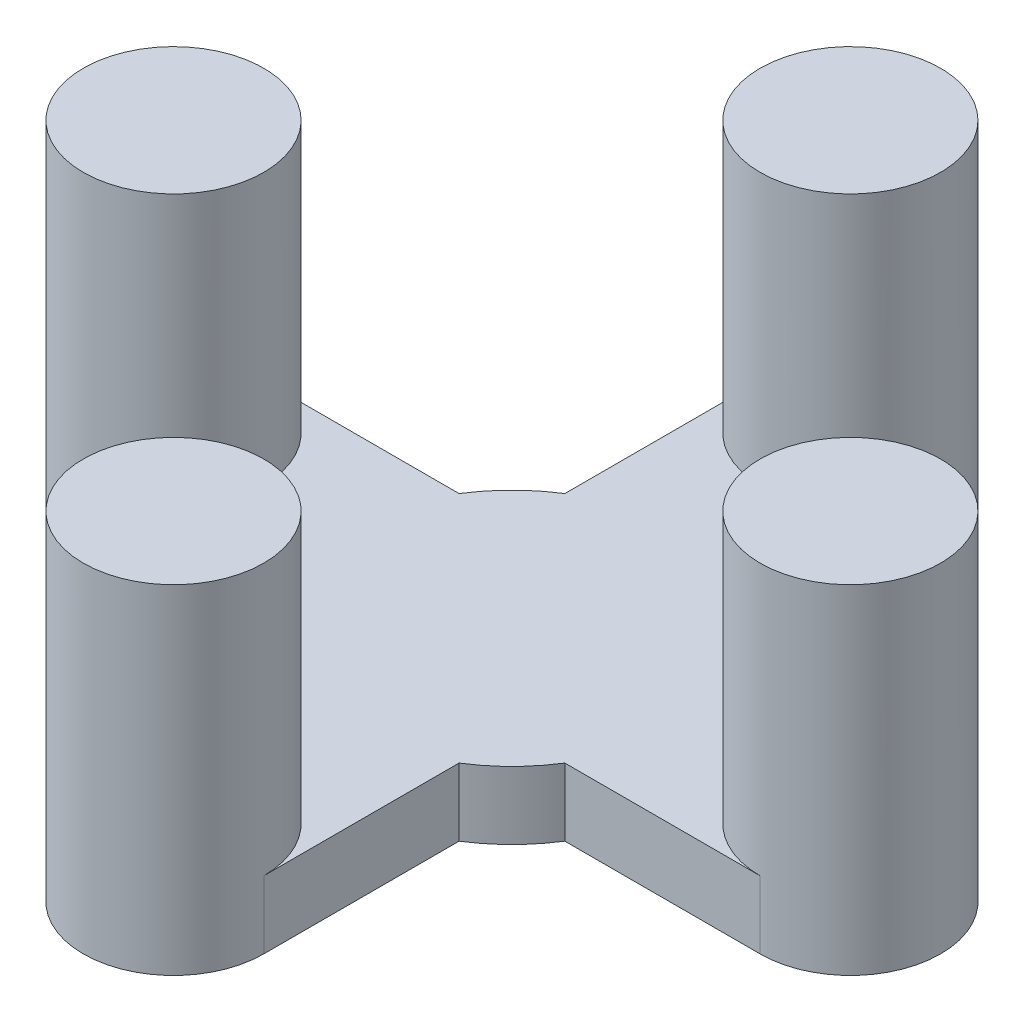
ISO-10303-21;
HEADER;
FILE_DESCRIPTION(('STEP AP214'),'2;1');
FILE_NAME('part.step','',(''),(''),'','','');
FILE_SCHEMA(('AUTOMOTIVE_DESIGN { 1 0 10303 214 1 1 1 1 }'));
ENDSEC;
DATA;
#1=APPLICATION_CONTEXT('core data for automotive mechanical design processes');
#2=APPLICATION_PROTOCOL_DEFINITION('international standard','automotive_design',2000,#1);
#3=PRODUCT_CONTEXT('',#1,'mechanical');
#4=PRODUCT('Part','Part','',(#3));
#5=PRODUCT_RELATED_PRODUCT_CATEGORY('part','',(#4));
#6=PRODUCT_DEFINITION_FORMATION('','',#4);
#7=PRODUCT_DEFINITION_CONTEXT('part definition',#1,'design');
#8=PRODUCT_DEFINITION('design','',#6,#7);
#9=PRODUCT_DEFINITION_SHAPE('','',#8);
#10=(LENGTH_UNIT() NAMED_UNIT(*) SI_UNIT(.MILLI.,.METRE.));
#11=(NAMED_UNIT(*) PLANE_ANGLE_UNIT() SI_UNIT($,.RADIAN.));
#12=(NAMED_UNIT(*) SI_UNIT($,.STERADIAN.) SOLID_ANGLE_UNIT());
#13=UNCERTAINTY_MEASURE_WITH_UNIT(LENGTH_MEASURE(1.E-05),#10,'distance_accuracy_value','');
#14=(GEOMETRIC_REPRESENTATION_CONTEXT(3) GLOBAL_UNCERTAINTY_ASSIGNED_CONTEXT((#13)) GLOBAL_UNIT_ASSIGNED_CONTEXT((#10,
#11,#12)) REPRESENTATION_CONTEXT('',''));
#15=CARTESIAN_POINT('',(0.,0.,0.));
#16=DIRECTION('',(0.,0.,1.));
#17=DIRECTION('',(1.,0.,0.));
#18=AXIS2_PLACEMENT_3D('',#15,#16,#17);
#19=CARTESIAN_POINT('',(0.,3.,0.));
#20=DIRECTION('',(0.,1.,0.));
#21=DIRECTION('',(0.,0.,1.));
#22=AXIS2_PLACEMENT_3D('',#19,#20,#21);
#23=PLANE('',#22);
#24=DIRECTION('',(0.,0.,-1.));
#25=VECTOR('',#24,1.);
#26=CARTESIAN_POINT('',(4.,3.,-15.));
#27=LINE('',#26,#25);
#28=CARTESIAN_POINT('',(4.,3.,-6.34428877022476));
#29=VERTEX_POINT('',#28);
#30=CARTESIAN_POINT('',(4.,3.,-15.));
#31=VERTEX_POINT('',#30);
#32=EDGE_CURVE('E284',#29,#31,#27,.T.);
#33=ORIENTED_EDGE('',*,*,#32,.T.);
#34=CARTESIAN_POINT('',(0.,3.,-15.));
#35=DIRECTION('',(0.,1.,0.));
#36=DIRECTION('',(0.,0.,1.));
#37=AXIS2_PLACEMENT_3D('',#34,#35,#36);
#38=CIRCLE('',#37,3.99999999999999);
#39=CARTESIAN_POINT('',(-4.,3.,-15.));
#40=VERTEX_POINT('',#39);
#41=EDGE_CURVE('E288',#40,#31,#38,.T.);
#42=ORIENTED_EDGE('',*,*,#41,.F.);
#43=DIRECTION('',(0.,0.,1.));
#44=VECTOR('',#43,1.);
#45=CARTESIAN_POINT('',(-4.,3.,-15.));
#46=LINE('',#45,#44);
#47=CARTESIAN_POINT('',(-3.99999999999999,3.,-6.34428877022476));
#48=VERTEX_POINT('',#47);
#49=EDGE_CURVE('E158',#40,#48,#46,.T.);
#50=ORIENTED_EDGE('',*,*,#49,.T.);
#51=CARTESIAN_POINT('',(0.,3.,0.));
#52=DIRECTION('',(0.,1.,0.));
#53=DIRECTION('',(0.,0.,1.));
#54=AXIS2_PLACEMENT_3D('',#51,#52,#53);
#55=CIRCLE('',#54,7.5);
#56=CARTESIAN_POINT('',(-6.34428877022475,3.,-4.00000000000001));
#57=VERTEX_POINT('',#56);
#58=EDGE_CURVE('E151',#48,#57,#55,.T.);
#59=ORIENTED_EDGE('',*,*,#58,.T.);
#60=DIRECTION('',(-1.,0.,0.));
#61=VECTOR('',#60,1.);
#62=CARTESIAN_POINT('',(-15.,3.,-4.00000000000001));
#63=LINE('',#62,#61);
#64=CARTESIAN_POINT('',(-15.,3.,-4.00000000000001));
#65=VERTEX_POINT('',#64);
#66=EDGE_CURVE('E154',#57,#65,#63,.T.);
#67=ORIENTED_EDGE('',*,*,#66,.T.);
#68=CARTESIAN_POINT('',(-15.,3.,0.));
#69=DIRECTION('',(0.,1.,0.));
#70=DIRECTION('',(0.,0.,1.));
#71=AXIS2_PLACEMENT_3D('',#68,#69,#70);
#72=CIRCLE('',#71,4.);
#73=CARTESIAN_POINT('',(-15.,3.,4.));
#74=VERTEX_POINT('',#73);
#75=EDGE_CURVE('E312',#74,#65,#72,.T.);
#76=ORIENTED_EDGE('',*,*,#75,.F.);
#77=DIRECTION('',(1.,0.,0.));
#78=VECTOR('',#77,1.);
#79=CARTESIAN_POINT('',(-15.,3.,4.00000000000001));
#80=LINE('',#79,#78);
#81=CARTESIAN_POINT('',(-6.34428877022476,3.,4.));
#82=VERTEX_POINT('',#81);
#83=EDGE_CURVE('E54',#74,#82,#80,.T.);
#84=ORIENTED_EDGE('',*,*,#83,.T.);
#85=CARTESIAN_POINT('',(0.,3.,0.));
#86=DIRECTION('',(0.,1.,0.));
#87=DIRECTION('',(0.,0.,1.));
#88=AXIS2_PLACEMENT_3D('',#85,#86,#87);
#89=CIRCLE('',#88,7.5);
#90=CARTESIAN_POINT('',(-3.99999999999999,3.,6.34428877022476));
#91=VERTEX_POINT('',#90);
#92=EDGE_CURVE('E211',#82,#91,#89,.T.);
#93=ORIENTED_EDGE('',*,*,#92,.T.);
#94=DIRECTION('',(0.,0.,1.));
#95=VECTOR('',#94,1.);
#96=CARTESIAN_POINT('',(-3.99999999999999,3.,6.34428877022476));
#97=LINE('',#96,#95);
#98=CARTESIAN_POINT('',(-4.,3.,15.));
#99=VERTEX_POINT('',#98);
#100=EDGE_CURVE('E124',#91,#99,#97,.T.);
#101=ORIENTED_EDGE('',*,*,#100,.T.);
#102=CARTESIAN_POINT('',(0.,3.,15.));
#103=DIRECTION('',(0.,1.,0.));
#104=DIRECTION('',(0.,0.,1.));
#105=AXIS2_PLACEMENT_3D('',#102,#103,#104);
#106=CIRCLE('',#105,4.);
#107=CARTESIAN_POINT('',(4.,3.,15.));
#108=VERTEX_POINT('',#107);
#109=EDGE_CURVE('E303',#108,#99,#106,.T.);
#110=ORIENTED_EDGE('',*,*,#109,.F.);
#111=DIRECTION('',(0.,0.,-1.));
#112=VECTOR('',#111,1.);
#113=CARTESIAN_POINT('',(4.,3.,6.34428877022476));
#114=LINE('',#113,#112);
#115=CARTESIAN_POINT('',(4.,3.,6.34428877022476));
#116=VERTEX_POINT('',#115);
#117=EDGE_CURVE('E267',#108,#116,#114,.T.);
#118=ORIENTED_EDGE('',*,*,#117,.T.);
#119=CARTESIAN_POINT('',(0.,3.,0.));
#120=DIRECTION('',(0.,1.,0.));
#121=DIRECTION('',(0.,0.,1.));
#122=AXIS2_PLACEMENT_3D('',#119,#120,#121);
#123=CIRCLE('',#122,7.5);
#124=CARTESIAN_POINT('',(6.34428877022476,3.,4.));
#125=VERTEX_POINT('',#124);
#126=EDGE_CURVE('E272',#116,#125,#123,.T.);
#127=ORIENTED_EDGE('',*,*,#126,.T.);
#128=DIRECTION('',(1.,0.,0.));
#129=VECTOR('',#128,1.);
#130=CARTESIAN_POINT('',(6.34428877022476,3.,4.));
#131=LINE('',#130,#129);
#132=CARTESIAN_POINT('',(15.,3.,4.));
#133=VERTEX_POINT('',#132);
#134=EDGE_CURVE('E274',#125,#133,#131,.T.);
#135=ORIENTED_EDGE('',*,*,#134,.T.);
#136=CARTESIAN_POINT('',(15.,3.,0.));
#137=DIRECTION('',(0.,1.,0.));
#138=DIRECTION('',(0.,0.,1.));
#139=AXIS2_PLACEMENT_3D('',#136,#137,#138);
#140=CIRCLE('',#139,4.);
#141=CARTESIAN_POINT('',(15.,3.,-4.00000000000001));
#142=VERTEX_POINT('',#141);
#143=EDGE_CURVE('E11',#133,#142,#140,.F.);
#144=ORIENTED_EDGE('',*,*,#143,.T.);
#145=DIRECTION('',(-1.,0.,0.));
#146=VECTOR('',#145,1.);
#147=CARTESIAN_POINT('',(6.34428877022476,3.,-4.00000000000001));
#148=LINE('',#147,#146);
#149=CARTESIAN_POINT('',(6.34428877022476,3.,-4.00000000000001));
#150=VERTEX_POINT('',#149);
#151=EDGE_CURVE('E280',#142,#150,#148,.T.);
#152=ORIENTED_EDGE('',*,*,#151,.T.);
#153=CARTESIAN_POINT('',(0.,3.,0.));
#154=DIRECTION('',(0.,1.,0.));
#155=DIRECTION('',(0.,0.,1.));
#156=AXIS2_PLACEMENT_3D('',#153,#154,#155);
#157=CIRCLE('',#156,7.5);
#158=EDGE_CURVE('E282',#150,#29,#157,.T.);
#159=ORIENTED_EDGE('',*,*,#158,.T.);
#160=EDGE_LOOP('',(#33,#42,#50,#59,#67,#76,#84,#93,#101,#110,#118,#127,#135,#144,#152,#159));
#161=FACE_BOUND('',#160,.T.);
#162=ADVANCED_FACE('F37',(#161),#23,.T.);
#163=CARTESIAN_POINT('',(0.,3.,0.));
#164=DIRECTION('',(0.,-1.,0.));
#165=DIRECTION('',(0.,0.,-1.));
#166=AXIS2_PLACEMENT_3D('',#163,#164,#165);
#167=CYLINDRICAL_SURFACE('',#166,7.5);
#168=CARTESIAN_POINT('',(0.,0.,0.));
#169=DIRECTION('',(0.,1.,0.));
#170=DIRECTION('',(0.,0.,1.));
#171=AXIS2_PLACEMENT_3D('',#168,#169,#170);
#172=CIRCLE('',#171,7.5);
#173=CARTESIAN_POINT('',(-6.34428877022476,0.,4.));
#174=VERTEX_POINT('',#173);
#175=CARTESIAN_POINT('',(-3.99999999999999,0.,6.34428877022476));
#176=VERTEX_POINT('',#175);
#177=EDGE_CURVE('E180',#174,#176,#172,.T.);
#178=ORIENTED_EDGE('',*,*,#177,.T.);
#179=DIRECTION('',(0.,-1.,0.));
#180=VECTOR('',#179,1.);
#181=CARTESIAN_POINT('',(-3.99999999999999,3.,6.34428877022476));
#182=LINE('',#181,#180);
#183=EDGE_CURVE('E46',#91,#176,#182,.T.);
#184=ORIENTED_EDGE('',*,*,#183,.F.);
#185=ORIENTED_EDGE('',*,*,#92,.F.);
#186=DIRECTION('',(0.,-1.,0.));
#187=VECTOR('',#186,1.);
#188=CARTESIAN_POINT('',(-6.34428877022476,3.,4.));
#189=LINE('',#188,#187);
#190=EDGE_CURVE('E176',#82,#174,#189,.T.);
#191=ORIENTED_EDGE('',*,*,#190,.T.);
#192=EDGE_LOOP('',(#178,#184,#185,#191));
#193=FACE_BOUND('',#192,.T.);
#194=ADVANCED_FACE('F39',(#193),#167,.T.);
#195=CARTESIAN_POINT('',(-3.99999999999999,3.,6.34428877022476));
#196=DIRECTION('',(1.,0.,0.));
#197=DIRECTION('',(0.,0.,-1.));
#198=AXIS2_PLACEMENT_3D('',#195,#196,#197);
#199=PLANE('',#198);
#200=DIRECTION('',(0.,0.,1.));
#201=VECTOR('',#200,1.);
#202=CARTESIAN_POINT('',(-3.99999999999999,0.,6.34428877022476));
#203=LINE('',#202,#201);
#204=CARTESIAN_POINT('',(-4.,0.,15.));
#205=VERTEX_POINT('',#204);
#206=EDGE_CURVE('E183',#176,#205,#203,.T.);
#207=ORIENTED_EDGE('',*,*,#206,.T.);
#208=DIRECTION('',(0.,-1.,0.));
#209=VECTOR('',#208,1.);
#210=CARTESIAN_POINT('',(-4.,3.,15.));
#211=LINE('',#210,#209);
#212=EDGE_CURVE('E244',#99,#205,#211,.T.);
#213=ORIENTED_EDGE('',*,*,#212,.F.);
#214=ORIENTED_EDGE('',*,*,#100,.F.);
#215=ORIENTED_EDGE('',*,*,#183,.T.);
#216=EDGE_LOOP('',(#207,#213,#214,#215));
#217=FACE_BOUND('',#216,.T.);
#218=ADVANCED_FACE('F247',(#217),#199,.F.);
#219=CARTESIAN_POINT('',(0.,3.,15.));
#220=DIRECTION('',(0.,-1.,0.));
#221=DIRECTION('',(0.,0.,-1.));
#222=AXIS2_PLACEMENT_3D('',#219,#220,#221);
#223=CYLINDRICAL_SURFACE('',#222,4.);
#224=CARTESIAN_POINT('',(0.,0.,15.));
#225=DIRECTION('',(0.,1.,0.));
#226=DIRECTION('',(0.,0.,1.));
#227=AXIS2_PLACEMENT_3D('',#224,#225,#226);
#228=CIRCLE('',#227,4.);
#229=CARTESIAN_POINT('',(4.,0.,15.));
#230=VERTEX_POINT('',#229);
#231=EDGE_CURVE('E186',#205,#230,#228,.T.);
#232=ORIENTED_EDGE('',*,*,#231,.T.);
#233=DIRECTION('',(0.,-1.,0.));
#234=VECTOR('',#233,1.);
#235=CARTESIAN_POINT('',(4.,3.,15.));
#236=LINE('',#235,#234);
#237=EDGE_CURVE('E241',#108,#230,#236,.T.);
#238=ORIENTED_EDGE('',*,*,#237,.F.);
#239=ORIENTED_EDGE('',*,*,#109,.T.);
#240=ORIENTED_EDGE('',*,*,#212,.T.);
#241=EDGE_LOOP('',(#232,#238,#239,#240));
#242=FACE_BOUND('',#241,.T.);
#243=CARTESIAN_POINT('',(0.,15.,15.));
#244=DIRECTION('',(0.,1.,0.));
#245=DIRECTION('',(0.,0.,1.));
#246=AXIS2_PLACEMENT_3D('',#243,#244,#245);
#247=CIRCLE('',#246,4.);
#248=CARTESIAN_POINT('',(0.,15.,19.));
#249=VERTEX_POINT('',#248);
#250=EDGE_CURVE('E299',#249,#249,#247,.T.);
#251=ORIENTED_EDGE('',*,*,#250,.F.);
#252=EDGE_LOOP('',(#251));
#253=FACE_BOUND('',#252,.T.);
#254=ADVANCED_FACE('F258',(#242,#253),#223,.T.);
#255=CARTESIAN_POINT('',(4.,3.,6.34428877022476));
#256=DIRECTION('',(-1.,0.,0.));
#257=DIRECTION('',(0.,0.,1.));
#258=AXIS2_PLACEMENT_3D('',#255,#256,#257);
#259=PLANE('',#258);
#260=DIRECTION('',(0.,0.,-1.));
#261=VECTOR('',#260,1.);
#262=CARTESIAN_POINT('',(4.,0.,6.34428877022476));
#263=LINE('',#262,#261);
#264=CARTESIAN_POINT('',(4.,0.,6.34428877022476));
#265=VERTEX_POINT('',#264);
#266=EDGE_CURVE('E188',#230,#265,#263,.T.);
#267=ORIENTED_EDGE('',*,*,#266,.T.);
#268=DIRECTION('',(0.,-1.,0.));
#269=VECTOR('',#268,1.);
#270=CARTESIAN_POINT('',(4.,3.,6.34428877022476));
#271=LINE('',#270,#269);
#272=EDGE_CURVE('E238',#116,#265,#271,.T.);
#273=ORIENTED_EDGE('',*,*,#272,.F.);
#274=ORIENTED_EDGE('',*,*,#117,.F.);
#275=ORIENTED_EDGE('',*,*,#237,.T.);
#276=EDGE_LOOP('',(#267,#273,#274,#275));
#277=FACE_BOUND('',#276,.T.);
#278=ADVANCED_FACE('F265',(#277),#259,.F.);
#279=CARTESIAN_POINT('',(0.,3.,0.));
#280=DIRECTION('',(0.,-1.,0.));
#281=DIRECTION('',(0.,0.,-1.));
#282=AXIS2_PLACEMENT_3D('',#279,#280,#281);
#283=CYLINDRICAL_SURFACE('',#282,7.5);
#284=CARTESIAN_POINT('',(0.,0.,0.));
#285=DIRECTION('',(0.,1.,0.));
#286=DIRECTION('',(0.,0.,1.));
#287=AXIS2_PLACEMENT_3D('',#284,#285,#286);
#288=CIRCLE('',#287,7.5);
#289=CARTESIAN_POINT('',(6.34428877022476,0.,4.));
#290=VERTEX_POINT('',#289);
#291=EDGE_CURVE('E190',#265,#290,#288,.T.);
#292=ORIENTED_EDGE('',*,*,#291,.T.);
#293=DIRECTION('',(0.,-1.,0.));
#294=VECTOR('',#293,1.);
#295=CARTESIAN_POINT('',(6.34428877022476,3.,4.));
#296=LINE('',#295,#294);
#297=EDGE_CURVE('E235',#125,#290,#296,.T.);
#298=ORIENTED_EDGE('',*,*,#297,.F.);
#299=ORIENTED_EDGE('',*,*,#126,.F.);
#300=ORIENTED_EDGE('',*,*,#272,.T.);
#301=EDGE_LOOP('',(#292,#298,#299,#300));
#302=FACE_BOUND('',#301,.T.);
#303=ADVANCED_FACE('F342',(#302),#283,.T.);
#304=CARTESIAN_POINT('',(6.34428877022476,3.,4.));
#305=DIRECTION('',(0.,0.,-1.));
#306=DIRECTION('',(-1.,0.,0.));
#307=AXIS2_PLACEMENT_3D('',#304,#305,#306);
#308=PLANE('',#307);
#309=DIRECTION('',(1.,0.,0.));
#310=VECTOR('',#309,1.);
#311=CARTESIAN_POINT('',(6.34428877022476,0.,4.));
#312=LINE('',#311,#310);
#313=CARTESIAN_POINT('',(15.,0.,4.));
#314=VERTEX_POINT('',#313);
#315=EDGE_CURVE('E192',#290,#314,#312,.T.);
#316=ORIENTED_EDGE('',*,*,#315,.T.);
#317=DIRECTION('',(0.,-1.,0.));
#318=VECTOR('',#317,1.);
#319=CARTESIAN_POINT('',(15.,3.,4.));
#320=LINE('',#319,#318);
#321=EDGE_CURVE('E232',#133,#314,#320,.T.);
#322=ORIENTED_EDGE('',*,*,#321,.F.);
#323=ORIENTED_EDGE('',*,*,#134,.F.);
#324=ORIENTED_EDGE('',*,*,#297,.T.);
#325=EDGE_LOOP('',(#316,#322,#323,#324));
#326=FACE_BOUND('',#325,.T.);
#327=ADVANCED_FACE('F339',(#326),#308,.F.);
#328=CARTESIAN_POINT('',(15.,3.,0.));
#329=DIRECTION('',(0.,-1.,0.));
#330=DIRECTION('',(0.,0.,-1.));
#331=AXIS2_PLACEMENT_3D('',#328,#329,#330);
#332=CYLINDRICAL_SURFACE('',#331,4.00000000000001);
#333=CARTESIAN_POINT('',(15.,0.,0.));
#334=DIRECTION('',(0.,1.,0.));
#335=DIRECTION('',(0.,0.,1.));
#336=AXIS2_PLACEMENT_3D('',#333,#334,#335);
#337=CIRCLE('',#336,4.00000000000001);
#338=CARTESIAN_POINT('',(15.,0.,-4.00000000000001));
#339=VERTEX_POINT('',#338);
#340=EDGE_CURVE('E194',#314,#339,#337,.T.);
#341=ORIENTED_EDGE('',*,*,#340,.T.);
#342=DIRECTION('',(0.,-1.,0.));
#343=VECTOR('',#342,1.);
#344=CARTESIAN_POINT('',(15.,3.,-4.00000000000001));
#345=LINE('',#344,#343);
#346=EDGE_CURVE('E229',#142,#339,#345,.T.);
#347=ORIENTED_EDGE('',*,*,#346,.F.);
#348=ORIENTED_EDGE('',*,*,#143,.F.);
#349=ORIENTED_EDGE('',*,*,#321,.T.);
#350=EDGE_LOOP('',(#341,#347,#348,#349));
#351=FACE_BOUND('',#350,.T.);
#352=CARTESIAN_POINT('',(15.,15.,0.));
#353=DIRECTION('',(0.,1.,0.));
#354=DIRECTION('',(0.,0.,1.));
#355=AXIS2_PLACEMENT_3D('',#352,#353,#354);
#356=CIRCLE('',#355,4.);
#357=CARTESIAN_POINT('',(15.,15.,4.));
#358=VERTEX_POINT('',#357);
#359=EDGE_CURVE('E308',#358,#358,#356,.T.);
#360=ORIENTED_EDGE('',*,*,#359,.F.);
#361=EDGE_LOOP('',(#360));
#362=FACE_BOUND('',#361,.T.);
#363=ADVANCED_FACE('F333',(#351,#362),#332,.T.);
#364=CARTESIAN_POINT('',(6.34428877022476,3.,-4.00000000000001));
#365=DIRECTION('',(0.,0.,1.));
#366=DIRECTION('',(1.,0.,0.));
#367=AXIS2_PLACEMENT_3D('',#364,#365,#366);
#368=PLANE('',#367);
#369=DIRECTION('',(-1.,0.,0.));
#370=VECTOR('',#369,1.);
#371=CARTESIAN_POINT('',(6.34428877022476,0.,-4.00000000000001));
#372=LINE('',#371,#370);
#373=CARTESIAN_POINT('',(6.34428877022476,0.,-4.00000000000001));
#374=VERTEX_POINT('',#373);
#375=EDGE_CURVE('E196',#339,#374,#372,.T.);
#376=ORIENTED_EDGE('',*,*,#375,.T.);
#377=DIRECTION('',(0.,-1.,0.));
#378=VECTOR('',#377,1.);
#379=CARTESIAN_POINT('',(6.34428877022476,3.,-4.00000000000001));
#380=LINE('',#379,#378);
#381=EDGE_CURVE('E226',#150,#374,#380,.T.);
#382=ORIENTED_EDGE('',*,*,#381,.F.);
#383=ORIENTED_EDGE('',*,*,#151,.F.);
#384=ORIENTED_EDGE('',*,*,#346,.T.);
#385=EDGE_LOOP('',(#376,#382,#383,#384));
#386=FACE_BOUND('',#385,.T.);
#387=ADVANCED_FACE('F330',(#386),#368,.F.);
#388=CARTESIAN_POINT('',(0.,3.,0.));
#389=DIRECTION('',(0.,-1.,0.));
#390=DIRECTION('',(0.,0.,-1.));
#391=AXIS2_PLACEMENT_3D('',#388,#389,#390);
#392=CYLINDRICAL_SURFACE('',#391,7.5);
#393=CARTESIAN_POINT('',(0.,0.,0.));
#394=DIRECTION('',(0.,1.,0.));
#395=DIRECTION('',(0.,0.,1.));
#396=AXIS2_PLACEMENT_3D('',#393,#394,#395);
#397=CIRCLE('',#396,7.5);
#398=CARTESIAN_POINT('',(4.,0.,-6.34428877022476));
#399=VERTEX_POINT('',#398);
#400=EDGE_CURVE('E198',#374,#399,#397,.T.);
#401=ORIENTED_EDGE('',*,*,#400,.T.);
#402=DIRECTION('',(0.,-1.,0.));
#403=VECTOR('',#402,1.);
#404=CARTESIAN_POINT('',(4.,3.,-6.34428877022476));
#405=LINE('',#404,#403);
#406=EDGE_CURVE('E223',#29,#399,#405,.T.);
#407=ORIENTED_EDGE('',*,*,#406,.F.);
#408=ORIENTED_EDGE('',*,*,#158,.F.);
#409=ORIENTED_EDGE('',*,*,#381,.T.);
#410=EDGE_LOOP('',(#401,#407,#408,#409));
#411=FACE_BOUND('',#410,.T.);
#412=ADVANCED_FACE('F329',(#411),#392,.T.);
#413=CARTESIAN_POINT('',(4.,3.,-15.));
#414=DIRECTION('',(-1.,0.,0.));
#415=DIRECTION('',(0.,0.,1.));
#416=AXIS2_PLACEMENT_3D('',#413,#414,#415);
#417=PLANE('',#416);
#418=DIRECTION('',(0.,0.,-1.));
#419=VECTOR('',#418,1.);
#420=CARTESIAN_POINT('',(4.,0.,-15.));
#421=LINE('',#420,#419);
#422=CARTESIAN_POINT('',(4.,0.,-15.));
#423=VERTEX_POINT('',#422);
#424=EDGE_CURVE('E200',#399,#423,#421,.T.);
#425=ORIENTED_EDGE('',*,*,#424,.T.);
#426=DIRECTION('',(0.,-1.,0.));
#427=VECTOR('',#426,1.);
#428=CARTESIAN_POINT('',(4.,3.,-15.));
#429=LINE('',#428,#427);
#430=EDGE_CURVE('E220',#31,#423,#429,.T.);
#431=ORIENTED_EDGE('',*,*,#430,.F.);
#432=ORIENTED_EDGE('',*,*,#32,.F.);
#433=ORIENTED_EDGE('',*,*,#406,.T.);
#434=EDGE_LOOP('',(#425,#431,#432,#433));
#435=FACE_BOUND('',#434,.T.);
#436=ADVANCED_FACE('F292',(#435),#417,.F.);
#437=CARTESIAN_POINT('',(0.,3.,-15.));
#438=DIRECTION('',(0.,-1.,0.));
#439=DIRECTION('',(0.,0.,-1.));
#440=AXIS2_PLACEMENT_3D('',#437,#438,#439);
#441=CYLINDRICAL_SURFACE('',#440,4.);
#442=CARTESIAN_POINT('',(0.,0.,-15.));
#443=DIRECTION('',(0.,1.,0.));
#444=DIRECTION('',(0.,0.,1.));
#445=AXIS2_PLACEMENT_3D('',#442,#443,#444);
#446=CIRCLE('',#445,4.);
#447=CARTESIAN_POINT('',(-4.,0.,-15.));
#448=VERTEX_POINT('',#447);
#449=EDGE_CURVE('E202',#423,#448,#446,.T.);
#450=ORIENTED_EDGE('',*,*,#449,.T.);
#451=DIRECTION('',(0.,-1.,0.));
#452=VECTOR('',#451,1.);
#453=CARTESIAN_POINT('',(-4.,3.,-15.));
#454=LINE('',#453,#452);
#455=EDGE_CURVE('E217',#40,#448,#454,.T.);
#456=ORIENTED_EDGE('',*,*,#455,.F.);
#457=ORIENTED_EDGE('',*,*,#41,.T.);
#458=ORIENTED_EDGE('',*,*,#430,.T.);
#459=EDGE_LOOP('',(#450,#456,#457,#458));
#460=FACE_BOUND('',#459,.T.);
#461=CARTESIAN_POINT('',(0.,15.,-15.));
#462=DIRECTION('',(0.,1.,0.));
#463=DIRECTION('',(0.,0.,1.));
#464=AXIS2_PLACEMENT_3D('',#461,#462,#463);
#465=CIRCLE('',#464,3.99999999999999);
#466=CARTESIAN_POINT('',(0.,15.,-11.));
#467=VERTEX_POINT('',#466);
#468=EDGE_CURVE('E300',#467,#467,#465,.T.);
#469=ORIENTED_EDGE('',*,*,#468,.F.);
#470=EDGE_LOOP('',(#469));
#471=FACE_BOUND('',#470,.T.);
#472=ADVANCED_FACE('F297',(#460,#471),#441,.T.);
#473=CARTESIAN_POINT('',(-4.,3.,-15.));
#474=DIRECTION('',(1.,0.,0.));
#475=DIRECTION('',(0.,0.,-1.));
#476=AXIS2_PLACEMENT_3D('',#473,#474,#475);
#477=PLANE('',#476);
#478=DIRECTION('',(0.,0.,1.));
#479=VECTOR('',#478,1.);
#480=CARTESIAN_POINT('',(-4.,0.,-15.));
#481=LINE('',#480,#479);
#482=CARTESIAN_POINT('',(-3.99999999999999,0.,-6.34428877022476));
#483=VERTEX_POINT('',#482);
#484=EDGE_CURVE('E204',#448,#483,#481,.T.);
#485=ORIENTED_EDGE('',*,*,#484,.T.);
#486=DIRECTION('',(0.,-1.,0.));
#487=VECTOR('',#486,1.);
#488=CARTESIAN_POINT('',(-3.99999999999999,3.,-6.34428877022476));
#489=LINE('',#488,#487);
#490=EDGE_CURVE('E170',#48,#483,#489,.T.);
#491=ORIENTED_EDGE('',*,*,#490,.F.);
#492=ORIENTED_EDGE('',*,*,#49,.F.);
#493=ORIENTED_EDGE('',*,*,#455,.T.);
#494=EDGE_LOOP('',(#485,#491,#492,#493));
#495=FACE_BOUND('',#494,.T.);
#496=ADVANCED_FACE('F323',(#495),#477,.F.);
#497=CARTESIAN_POINT('',(0.,3.,0.));
#498=DIRECTION('',(0.,-1.,0.));
#499=DIRECTION('',(0.,0.,-1.));
#500=AXIS2_PLACEMENT_3D('',#497,#498,#499);
#501=CYLINDRICAL_SURFACE('',#500,7.5);
#502=CARTESIAN_POINT('',(0.,0.,0.));
#503=DIRECTION('',(0.,1.,0.));
#504=DIRECTION('',(0.,0.,1.));
#505=AXIS2_PLACEMENT_3D('',#502,#503,#504);
#506=CIRCLE('',#505,7.5);
#507=CARTESIAN_POINT('',(-6.34428877022475,0.,-4.00000000000001));
#508=VERTEX_POINT('',#507);
#509=EDGE_CURVE('E167',#483,#508,#506,.T.);
#510=ORIENTED_EDGE('',*,*,#509,.T.);
#511=DIRECTION('',(0.,-1.,0.));
#512=VECTOR('',#511,1.);
#513=CARTESIAN_POINT('',(-6.34428877022475,3.,-4.00000000000001));
#514=LINE('',#513,#512);
#515=EDGE_CURVE('E164',#57,#508,#514,.T.);
#516=ORIENTED_EDGE('',*,*,#515,.F.);
#517=ORIENTED_EDGE('',*,*,#58,.F.);
#518=ORIENTED_EDGE('',*,*,#490,.T.);
#519=EDGE_LOOP('',(#510,#516,#517,#518));
#520=FACE_BOUND('',#519,.T.);
#521=ADVANCED_FACE('F165',(#520),#501,.T.);
#522=CARTESIAN_POINT('',(-15.,3.,-4.00000000000001));
#523=DIRECTION('',(0.,0.,1.));
#524=DIRECTION('',(1.,0.,0.));
#525=AXIS2_PLACEMENT_3D('',#522,#523,#524);
#526=PLANE('',#525);
#527=DIRECTION('',(-1.,0.,0.));
#528=VECTOR('',#527,1.);
#529=CARTESIAN_POINT('',(-15.,0.,-4.00000000000001));
#530=LINE('',#529,#528);
#531=CARTESIAN_POINT('',(-15.,0.,-4.00000000000001));
#532=VERTEX_POINT('',#531);
#533=EDGE_CURVE('E207',#508,#532,#530,.T.);
#534=ORIENTED_EDGE('',*,*,#533,.T.);
#535=DIRECTION('',(0.,-1.,0.));
#536=VECTOR('',#535,1.);
#537=CARTESIAN_POINT('',(-15.,3.,-4.00000000000001));
#538=LINE('',#537,#536);
#539=EDGE_CURVE('E171',#65,#532,#538,.T.);
#540=ORIENTED_EDGE('',*,*,#539,.F.);
#541=ORIENTED_EDGE('',*,*,#66,.F.);
#542=ORIENTED_EDGE('',*,*,#515,.T.);
#543=EDGE_LOOP('',(#534,#540,#541,#542));
#544=FACE_BOUND('',#543,.T.);
#545=ADVANCED_FACE('F173',(#544),#526,.F.);
#546=CARTESIAN_POINT('',(-15.,3.,0.));
#547=DIRECTION('',(0.,-1.,0.));
#548=DIRECTION('',(0.,0.,-1.));
#549=AXIS2_PLACEMENT_3D('',#546,#547,#548);
#550=CYLINDRICAL_SURFACE('',#549,4.00000000000001);
#551=CARTESIAN_POINT('',(-15.,0.,0.));
#552=DIRECTION('',(0.,1.,0.));
#553=DIRECTION('',(0.,0.,1.));
#554=AXIS2_PLACEMENT_3D('',#551,#552,#553);
#555=CIRCLE('',#554,4.00000000000001);
#556=CARTESIAN_POINT('',(-15.,0.,4.00000000000001));
#557=VERTEX_POINT('',#556);
#558=EDGE_CURVE('E109',#532,#557,#555,.T.);
#559=ORIENTED_EDGE('',*,*,#558,.T.);
#560=DIRECTION('',(0.,-1.,0.));
#561=VECTOR('',#560,1.);
#562=CARTESIAN_POINT('',(-15.,3.,4.00000000000001));
#563=LINE('',#562,#561);
#564=EDGE_CURVE('E213',#74,#557,#563,.T.);
#565=ORIENTED_EDGE('',*,*,#564,.F.);
#566=ORIENTED_EDGE('',*,*,#75,.T.);
#567=ORIENTED_EDGE('',*,*,#539,.T.);
#568=EDGE_LOOP('',(#559,#565,#566,#567));
#569=FACE_BOUND('',#568,.T.);
#570=CARTESIAN_POINT('',(-15.,15.,0.));
#571=DIRECTION('',(0.,1.,0.));
#572=DIRECTION('',(0.,0.,1.));
#573=AXIS2_PLACEMENT_3D('',#570,#571,#572);
#574=CIRCLE('',#573,4.);
#575=CARTESIAN_POINT('',(-15.,15.,4.));
#576=VERTEX_POINT('',#575);
#577=EDGE_CURVE('E184',#576,#576,#574,.T.);
#578=ORIENTED_EDGE('',*,*,#577,.F.);
#579=EDGE_LOOP('',(#578));
#580=FACE_BOUND('',#579,.T.);
#581=ADVANCED_FACE('F315',(#569,#580),#550,.T.);
#582=CARTESIAN_POINT('',(-15.,3.,4.00000000000001));
#583=DIRECTION('',(0.,0.,-1.));
#584=DIRECTION('',(-1.,0.,0.));
#585=AXIS2_PLACEMENT_3D('',#582,#583,#584);
#586=PLANE('',#585);
#587=DIRECTION('',(1.,0.,0.));
#588=VECTOR('',#587,1.);
#589=CARTESIAN_POINT('',(-15.,0.,4.00000000000001));
#590=LINE('',#589,#588);
#591=EDGE_CURVE('E115',#557,#174,#590,.T.);
#592=ORIENTED_EDGE('',*,*,#591,.T.);
#593=ORIENTED_EDGE('',*,*,#190,.F.);
#594=ORIENTED_EDGE('',*,*,#83,.F.);
#595=ORIENTED_EDGE('',*,*,#564,.T.);
#596=EDGE_LOOP('',(#592,#593,#594,#595));
#597=FACE_BOUND('',#596,.T.);
#598=ADVANCED_FACE('F362',(#597),#586,.F.);
#599=CARTESIAN_POINT('',(0.,0.,0.));
#600=DIRECTION('',(0.,1.,0.));
#601=DIRECTION('',(0.,0.,1.));
#602=AXIS2_PLACEMENT_3D('',#599,#600,#601);
#603=PLANE('',#602);
#604=ORIENTED_EDGE('',*,*,#177,.F.);
#605=ORIENTED_EDGE('',*,*,#591,.F.);
#606=ORIENTED_EDGE('',*,*,#558,.F.);
#607=ORIENTED_EDGE('',*,*,#533,.F.);
#608=ORIENTED_EDGE('',*,*,#509,.F.);
#609=ORIENTED_EDGE('',*,*,#484,.F.);
#610=ORIENTED_EDGE('',*,*,#449,.F.);
#611=ORIENTED_EDGE('',*,*,#424,.F.);
#612=ORIENTED_EDGE('',*,*,#400,.F.);
#613=ORIENTED_EDGE('',*,*,#375,.F.);
#614=ORIENTED_EDGE('',*,*,#340,.F.);
#615=ORIENTED_EDGE('',*,*,#315,.F.);
#616=ORIENTED_EDGE('',*,*,#291,.F.);
#617=ORIENTED_EDGE('',*,*,#266,.F.);
#618=ORIENTED_EDGE('',*,*,#231,.F.);
#619=ORIENTED_EDGE('',*,*,#206,.F.);
#620=EDGE_LOOP('',(#604,#605,#606,#607,#608,#609,#610,#611,#612,#613,#614,#615,#616,#617,#618,#619));
#621=FACE_BOUND('',#620,.T.);
#622=ADVANCED_FACE('F252',(#621),#603,.F.);
#623=CARTESIAN_POINT('',(-15.,15.,0.));
#624=DIRECTION('',(0.,1.,0.));
#625=DIRECTION('',(0.,0.,1.));
#626=AXIS2_PLACEMENT_3D('',#623,#624,#625);
#627=PLANE('',#626);
#628=ORIENTED_EDGE('',*,*,#577,.T.);
#629=EDGE_LOOP('',(#628));
#630=FACE_BOUND('',#629,.T.);
#631=ADVANCED_FACE('F358',(#630),#627,.T.);
#632=CARTESIAN_POINT('',(15.,15.,0.));
#633=DIRECTION('',(0.,1.,0.));
#634=DIRECTION('',(0.,0.,1.));
#635=AXIS2_PLACEMENT_3D('',#632,#633,#634);
#636=PLANE('',#635);
#637=ORIENTED_EDGE('',*,*,#359,.T.);
#638=EDGE_LOOP('',(#637));
#639=FACE_BOUND('',#638,.T.);
#640=ADVANCED_FACE('F432',(#639),#636,.T.);
#641=CARTESIAN_POINT('',(0.,15.,15.));
#642=DIRECTION('',(0.,1.,0.));
#643=DIRECTION('',(0.,0.,1.));
#644=AXIS2_PLACEMENT_3D('',#641,#642,#643);
#645=PLANE('',#644);
#646=ORIENTED_EDGE('',*,*,#250,.T.);
#647=EDGE_LOOP('',(#646));
#648=FACE_BOUND('',#647,.T.);
#649=ADVANCED_FACE('F439',(#648),#645,.T.);
#650=CARTESIAN_POINT('',(0.,15.,-15.));
#651=DIRECTION('',(0.,1.,0.));
#652=DIRECTION('',(0.,0.,1.));
#653=AXIS2_PLACEMENT_3D('',#650,#651,#652);
#654=PLANE('',#653);
#655=ORIENTED_EDGE('',*,*,#468,.T.);
#656=EDGE_LOOP('',(#655));
#657=FACE_BOUND('',#656,.T.);
#658=ADVANCED_FACE('F446',(#657),#654,.T.);
#659=CLOSED_SHELL('',(#162,#194,#218,#254,#278,#303,#327,#363,#387,#412,#436,#472,#496,#521,
#545,#581,#598,#622,#631,#640,#649,#658));
#660=MANIFOLD_SOLID_BREP('B2',#659);
#661=ADVANCED_BREP_SHAPE_REPRESENTATION('',(#18,#660),#14);
#662=SHAPE_DEFINITION_REPRESENTATION(#9,#661);
ENDSEC;
END-ISO-10303-21;
